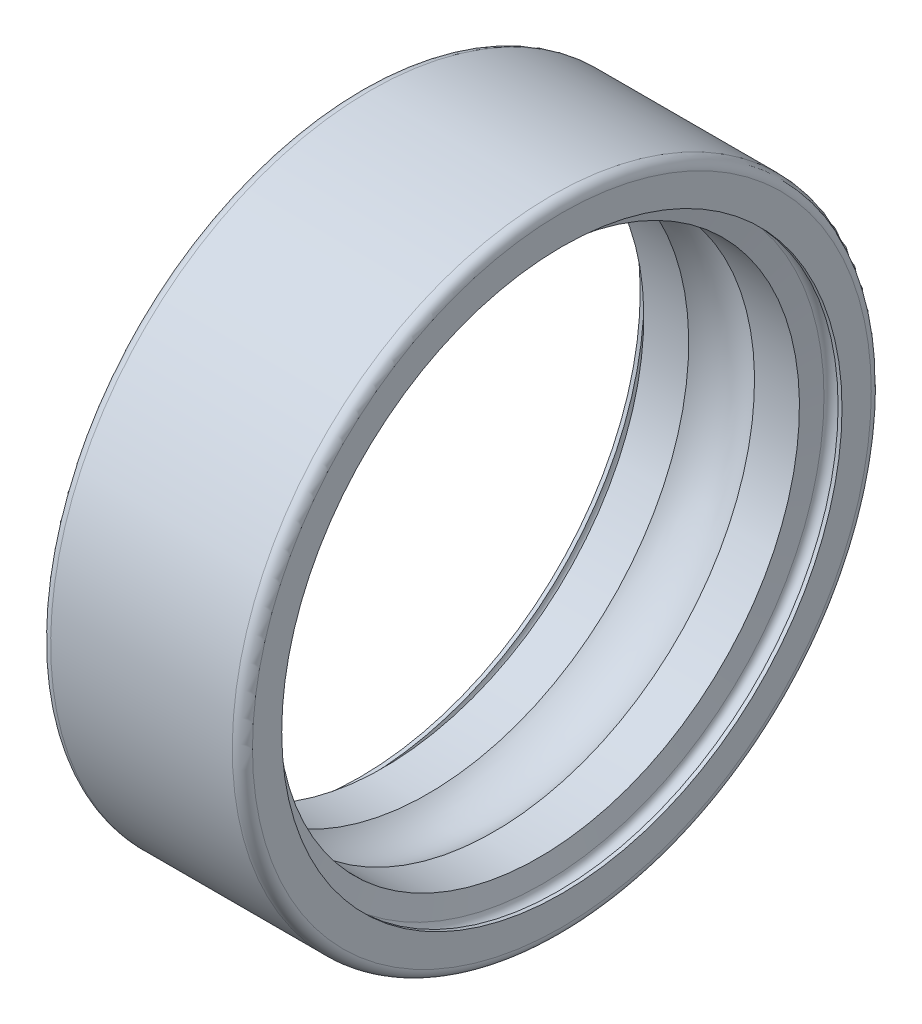
ISO-10303-21;
HEADER;
FILE_DESCRIPTION(('STEP AP214'),'2;1');
FILE_NAME('part.step','',(''),(''),'','','');
FILE_SCHEMA(('AUTOMOTIVE_DESIGN { 1 0 10303 214 1 1 1 1 }'));
ENDSEC;
DATA;
#1=APPLICATION_CONTEXT('core data for automotive mechanical design processes');
#2=APPLICATION_PROTOCOL_DEFINITION('international standard','automotive_design',2000,#1);
#3=PRODUCT_CONTEXT('',#1,'mechanical');
#4=PRODUCT('Part','Part','',(#3));
#5=PRODUCT_RELATED_PRODUCT_CATEGORY('part','',(#4));
#6=PRODUCT_DEFINITION_FORMATION('','',#4);
#7=PRODUCT_DEFINITION_CONTEXT('part definition',#1,'design');
#8=PRODUCT_DEFINITION('design','',#6,#7);
#9=PRODUCT_DEFINITION_SHAPE('','',#8);
#10=(LENGTH_UNIT() NAMED_UNIT(*) SI_UNIT(.MILLI.,.METRE.));
#11=(NAMED_UNIT(*) PLANE_ANGLE_UNIT() SI_UNIT($,.RADIAN.));
#12=(NAMED_UNIT(*) SI_UNIT($,.STERADIAN.) SOLID_ANGLE_UNIT());
#13=UNCERTAINTY_MEASURE_WITH_UNIT(LENGTH_MEASURE(1.E-05),#10,'distance_accuracy_value','');
#14=(GEOMETRIC_REPRESENTATION_CONTEXT(3) GLOBAL_UNCERTAINTY_ASSIGNED_CONTEXT((#13)) GLOBAL_UNIT_ASSIGNED_CONTEXT((#10,
#11,#12)) REPRESENTATION_CONTEXT('',''));
#15=CARTESIAN_POINT('',(0.,0.,0.));
#16=DIRECTION('',(0.,0.,1.));
#17=DIRECTION('',(1.,0.,0.));
#18=AXIS2_PLACEMENT_3D('',#15,#16,#17);
#19=CARTESIAN_POINT('',(5.652,0.,0.));
#20=DIRECTION('',(1.,0.,0.));
#21=DIRECTION('',(0.,0.,-1.));
#22=AXIS2_PLACEMENT_3D('',#19,#20,#21);
#23=TOROIDAL_SURFACE('',#22,8.33,0.232);
#24=CARTESIAN_POINT('',(5.884,0.,0.));
#25=DIRECTION('',(1.,0.,0.));
#26=DIRECTION('',(0.,1.,0.));
#27=AXIS2_PLACEMENT_3D('',#24,#25,#26);
#28=CIRCLE('',#27,8.33);
#29=CARTESIAN_POINT('',(5.884,8.33,0.));
#30=VERTEX_POINT('',#29);
#31=EDGE_CURVE('E10',#30,#30,#28,.T.);
#32=ORIENTED_EDGE('',*,*,#31,.T.);
#33=EDGE_LOOP('',(#32));
#34=FACE_BOUND('',#33,.T.);
#35=CARTESIAN_POINT('',(5.42352460130117,0.,0.));
#36=DIRECTION('',(1.,0.,0.));
#37=DIRECTION('',(0.,1.,0.));
#38=AXIS2_PLACEMENT_3D('',#35,#36,#37);
#39=CIRCLE('',#38,8.37028637721873);
#40=CARTESIAN_POINT('',(5.42352460130117,8.37028637721873,0.));
#41=VERTEX_POINT('',#40);
#42=EDGE_CURVE('E82',#41,#41,#39,.T.);
#43=ORIENTED_EDGE('',*,*,#42,.F.);
#44=EDGE_LOOP('',(#43));
#45=FACE_BOUND('',#44,.T.);
#46=ADVANCED_FACE('F15',(#34,#45),#23,.F.);
#47=CARTESIAN_POINT('',(5.942,0.,0.));
#48=DIRECTION('',(-1.,0.,0.));
#49=DIRECTION('',(0.,1.,0.));
#50=AXIS2_PLACEMENT_3D('',#47,#48,#49);
#51=CYLINDRICAL_SURFACE('',#50,8.33);
#52=CARTESIAN_POINT('',(6.,0.,0.));
#53=DIRECTION('',(1.,0.,0.));
#54=DIRECTION('',(0.,1.,0.));
#55=AXIS2_PLACEMENT_3D('',#52,#53,#54);
#56=CIRCLE('',#55,8.33);
#57=CARTESIAN_POINT('',(6.,8.33,0.));
#58=VERTEX_POINT('',#57);
#59=EDGE_CURVE('E25',#58,#58,#56,.T.);
#60=ORIENTED_EDGE('',*,*,#59,.T.);
#61=EDGE_LOOP('',(#60));
#62=FACE_BOUND('',#61,.T.);
#63=ORIENTED_EDGE('',*,*,#31,.F.);
#64=EDGE_LOOP('',(#63));
#65=FACE_BOUND('',#64,.T.);
#66=ADVANCED_FACE('F121',(#62,#65),#51,.F.);
#67=CARTESIAN_POINT('',(6.,8.765,0.));
#68=DIRECTION('',(1.,0.,0.));
#69=DIRECTION('',(0.,1.,0.));
#70=AXIS2_PLACEMENT_3D('',#67,#68,#69);
#71=PLANE('',#70);
#72=CARTESIAN_POINT('',(6.,0.,0.));
#73=DIRECTION('',(1.,0.,0.));
#74=DIRECTION('',(0.,1.,0.));
#75=AXIS2_PLACEMENT_3D('',#72,#73,#74);
#76=CIRCLE('',#75,9.2);
#77=CARTESIAN_POINT('',(6.,9.2,0.));
#78=VERTEX_POINT('',#77);
#79=EDGE_CURVE('E87',#78,#78,#76,.T.);
#80=ORIENTED_EDGE('',*,*,#79,.T.);
#81=EDGE_LOOP('',(#80));
#82=FACE_BOUND('',#81,.T.);
#83=ORIENTED_EDGE('',*,*,#59,.F.);
#84=EDGE_LOOP('',(#83));
#85=FACE_BOUND('',#84,.T.);
#86=ADVANCED_FACE('F125',(#82,#85),#71,.T.);
#87=CARTESIAN_POINT('',(5.7,0.,0.));
#88=DIRECTION('',(1.,0.,0.));
#89=DIRECTION('',(0.,0.,-1.));
#90=AXIS2_PLACEMENT_3D('',#87,#88,#89);
#91=TOROIDAL_SURFACE('',#90,9.2,0.3);
#92=CARTESIAN_POINT('',(5.7,0.,0.));
#93=DIRECTION('',(1.,0.,0.));
#94=DIRECTION('',(0.,1.,0.));
#95=AXIS2_PLACEMENT_3D('',#92,#93,#94);
#96=CIRCLE('',#95,9.5);
#97=CARTESIAN_POINT('',(5.7,9.5,0.));
#98=VERTEX_POINT('',#97);
#99=EDGE_CURVE('E85',#98,#98,#96,.T.);
#100=ORIENTED_EDGE('',*,*,#99,.T.);
#101=EDGE_LOOP('',(#100));
#102=FACE_BOUND('',#101,.T.);
#103=ORIENTED_EDGE('',*,*,#79,.F.);
#104=EDGE_LOOP('',(#103));
#105=FACE_BOUND('',#104,.T.);
#106=ADVANCED_FACE('F129',(#102,#105),#91,.T.);
#107=CARTESIAN_POINT('',(3.,0.,0.));
#108=DIRECTION('',(-1.,0.,0.));
#109=DIRECTION('',(0.,1.,0.));
#110=AXIS2_PLACEMENT_3D('',#107,#108,#109);
#111=CYLINDRICAL_SURFACE('',#110,9.5);
#112=CARTESIAN_POINT('',(0.3,0.,0.));
#113=DIRECTION('',(1.,0.,0.));
#114=DIRECTION('',(0.,1.,0.));
#115=AXIS2_PLACEMENT_3D('',#112,#113,#114);
#116=CIRCLE('',#115,9.5);
#117=CARTESIAN_POINT('',(0.3,9.5,0.));
#118=VERTEX_POINT('',#117);
#119=EDGE_CURVE('E83',#118,#118,#116,.T.);
#120=ORIENTED_EDGE('',*,*,#119,.T.);
#121=EDGE_LOOP('',(#120));
#122=FACE_BOUND('',#121,.T.);
#123=ORIENTED_EDGE('',*,*,#99,.F.);
#124=EDGE_LOOP('',(#123));
#125=FACE_BOUND('',#124,.T.);
#126=ADVANCED_FACE('F131',(#122,#125),#111,.T.);
#127=CARTESIAN_POINT('',(0.3,0.,0.));
#128=DIRECTION('',(1.,0.,0.));
#129=DIRECTION('',(0.,0.,-1.));
#130=AXIS2_PLACEMENT_3D('',#127,#128,#129);
#131=TOROIDAL_SURFACE('',#130,9.2,0.3);
#132=CARTESIAN_POINT('',(0.,0.,0.));
#133=DIRECTION('',(1.,0.,0.));
#134=DIRECTION('',(0.,1.,0.));
#135=AXIS2_PLACEMENT_3D('',#132,#133,#134);
#136=CIRCLE('',#135,9.2);
#137=CARTESIAN_POINT('',(0.,9.2,0.));
#138=VERTEX_POINT('',#137);
#139=EDGE_CURVE('E86',#138,#138,#136,.T.);
#140=ORIENTED_EDGE('',*,*,#139,.T.);
#141=EDGE_LOOP('',(#140));
#142=FACE_BOUND('',#141,.T.);
#143=ORIENTED_EDGE('',*,*,#119,.F.);
#144=EDGE_LOOP('',(#143));
#145=FACE_BOUND('',#144,.T.);
#146=ADVANCED_FACE('F156',(#142,#145),#131,.T.);
#147=CARTESIAN_POINT('',(0.,8.765,0.));
#148=DIRECTION('',(-1.,0.,0.));
#149=DIRECTION('',(0.,-1.,0.));
#150=AXIS2_PLACEMENT_3D('',#147,#148,#149);
#151=PLANE('',#150);
#152=CARTESIAN_POINT('',(0.,0.,0.));
#153=DIRECTION('',(1.,0.,0.));
#154=DIRECTION('',(0.,1.,0.));
#155=AXIS2_PLACEMENT_3D('',#152,#153,#154);
#156=CIRCLE('',#155,8.33);
#157=CARTESIAN_POINT('',(0.,8.33,0.));
#158=VERTEX_POINT('',#157);
#159=EDGE_CURVE('E88',#158,#158,#156,.T.);
#160=ORIENTED_EDGE('',*,*,#159,.T.);
#161=EDGE_LOOP('',(#160));
#162=FACE_BOUND('',#161,.T.);
#163=ORIENTED_EDGE('',*,*,#139,.F.);
#164=EDGE_LOOP('',(#163));
#165=FACE_BOUND('',#164,.T.);
#166=ADVANCED_FACE('F148',(#162,#165),#151,.T.);
#167=CARTESIAN_POINT('',(0.058,0.,0.));
#168=DIRECTION('',(-1.,0.,0.));
#169=DIRECTION('',(0.,1.,0.));
#170=AXIS2_PLACEMENT_3D('',#167,#168,#169);
#171=CYLINDRICAL_SURFACE('',#170,8.33);
#172=CARTESIAN_POINT('',(0.116,0.,0.));
#173=DIRECTION('',(1.,0.,0.));
#174=DIRECTION('',(0.,1.,0.));
#175=AXIS2_PLACEMENT_3D('',#172,#173,#174);
#176=CIRCLE('',#175,8.33);
#177=CARTESIAN_POINT('',(0.116,8.33,0.));
#178=VERTEX_POINT('',#177);
#179=EDGE_CURVE('E74',#178,#178,#176,.T.);
#180=ORIENTED_EDGE('',*,*,#179,.T.);
#181=EDGE_LOOP('',(#180));
#182=FACE_BOUND('',#181,.T.);
#183=ORIENTED_EDGE('',*,*,#159,.F.);
#184=EDGE_LOOP('',(#183));
#185=FACE_BOUND('',#184,.T.);
#186=ADVANCED_FACE('F143',(#182,#185),#171,.F.);
#187=CARTESIAN_POINT('',(0.348,0.,0.));
#188=DIRECTION('',(1.,0.,0.));
#189=DIRECTION('',(0.,0.,-1.));
#190=AXIS2_PLACEMENT_3D('',#187,#188,#189);
#191=TOROIDAL_SURFACE('',#190,8.33,0.232);
#192=CARTESIAN_POINT('',(0.576475398698832,0.,0.));
#193=DIRECTION('',(1.,0.,0.));
#194=DIRECTION('',(0.,1.,0.));
#195=AXIS2_PLACEMENT_3D('',#192,#193,#194);
#196=CIRCLE('',#195,8.37028637721873);
#197=CARTESIAN_POINT('',(0.576475398698832,8.37028637721873,0.));
#198=VERTEX_POINT('',#197);
#199=EDGE_CURVE('E65',#198,#198,#196,.T.);
#200=ORIENTED_EDGE('',*,*,#199,.T.);
#201=EDGE_LOOP('',(#200));
#202=FACE_BOUND('',#201,.T.);
#203=ORIENTED_EDGE('',*,*,#179,.F.);
#204=EDGE_LOOP('',(#203));
#205=FACE_BOUND('',#204,.T.);
#206=ADVANCED_FACE('F138',(#202,#205),#191,.F.);
#207=CARTESIAN_POINT('',(0.631162010733617,0.,0.));
#208=DIRECTION('',(-1.,0.,0.));
#209=DIRECTION('',(0.,1.,0.));
#210=AXIS2_PLACEMENT_3D('',#207,#208,#209);
#211=CONICAL_SURFACE('',#210,8.06014318860936,1.39626340159546);
#212=CARTESIAN_POINT('',(0.685848622768402,0.,0.));
#213=DIRECTION('',(1.,0.,0.));
#214=DIRECTION('',(0.,1.,0.));
#215=AXIS2_PLACEMENT_3D('',#212,#213,#214);
#216=CIRCLE('',#215,7.75);
#217=CARTESIAN_POINT('',(0.685848622768403,7.75,0.));
#218=VERTEX_POINT('',#217);
#219=EDGE_CURVE('E70',#218,#218,#216,.T.);
#220=ORIENTED_EDGE('',*,*,#219,.T.);
#221=EDGE_LOOP('',(#220));
#222=FACE_BOUND('',#221,.T.);
#223=ORIENTED_EDGE('',*,*,#199,.F.);
#224=EDGE_LOOP('',(#223));
#225=FACE_BOUND('',#224,.T.);
#226=ADVANCED_FACE('F17',(#222,#225),#211,.F.);
#227=CARTESIAN_POINT('',(1.35362474823296,0.,0.));
#228=DIRECTION('',(-1.,0.,0.));
#229=DIRECTION('',(0.,1.,0.));
#230=AXIS2_PLACEMENT_3D('',#227,#228,#229);
#231=CYLINDRICAL_SURFACE('',#230,7.75);
#232=CARTESIAN_POINT('',(2.02140087369751,0.,0.));
#233=DIRECTION('',(1.,0.,0.));
#234=DIRECTION('',(0.,1.,0.));
#235=AXIS2_PLACEMENT_3D('',#232,#233,#234);
#236=CIRCLE('',#235,7.75);
#237=CARTESIAN_POINT('',(2.02140087369751,7.75,0.));
#238=VERTEX_POINT('',#237);
#239=EDGE_CURVE('E19',#238,#238,#236,.T.);
#240=ORIENTED_EDGE('',*,*,#239,.T.);
#241=EDGE_LOOP('',(#240));
#242=FACE_BOUND('',#241,.T.);
#243=ORIENTED_EDGE('',*,*,#219,.F.);
#244=EDGE_LOOP('',(#243));
#245=FACE_BOUND('',#244,.T.);
#246=ADVANCED_FACE('F116',(#242,#245),#231,.F.);
#247=CARTESIAN_POINT('',(3.,0.,0.));
#248=DIRECTION('',(1.,0.,0.));
#249=DIRECTION('',(0.,0.,-1.));
#250=AXIS2_PLACEMENT_3D('',#247,#248,#249);
#251=TOROIDAL_SURFACE('',#250,6.5,1.5875);
#252=CARTESIAN_POINT('',(3.97859912630249,0.,0.));
#253=DIRECTION('',(1.,0.,0.));
#254=DIRECTION('',(0.,1.,0.));
#255=AXIS2_PLACEMENT_3D('',#252,#253,#254);
#256=CIRCLE('',#255,7.75);
#257=CARTESIAN_POINT('',(3.97859912630249,7.75,0.));
#258=VERTEX_POINT('',#257);
#259=EDGE_CURVE('E76',#258,#258,#256,.T.);
#260=ORIENTED_EDGE('',*,*,#259,.T.);
#261=EDGE_LOOP('',(#260));
#262=FACE_BOUND('',#261,.T.);
#263=ORIENTED_EDGE('',*,*,#239,.F.);
#264=EDGE_LOOP('',(#263));
#265=FACE_BOUND('',#264,.T.);
#266=ADVANCED_FACE('F102',(#262,#265),#251,.F.);
#267=CARTESIAN_POINT('',(4.64637525176704,0.,0.));
#268=DIRECTION('',(-1.,0.,0.));
#269=DIRECTION('',(0.,1.,0.));
#270=AXIS2_PLACEMENT_3D('',#267,#268,#269);
#271=CYLINDRICAL_SURFACE('',#270,7.75);
#272=CARTESIAN_POINT('',(5.3141513772316,0.,0.));
#273=DIRECTION('',(1.,0.,0.));
#274=DIRECTION('',(0.,1.,0.));
#275=AXIS2_PLACEMENT_3D('',#272,#273,#274);
#276=CIRCLE('',#275,7.75);
#277=CARTESIAN_POINT('',(5.3141513772316,7.75,0.));
#278=VERTEX_POINT('',#277);
#279=EDGE_CURVE('E80',#278,#278,#276,.T.);
#280=ORIENTED_EDGE('',*,*,#279,.T.);
#281=EDGE_LOOP('',(#280));
#282=FACE_BOUND('',#281,.T.);
#283=ORIENTED_EDGE('',*,*,#259,.F.);
#284=EDGE_LOOP('',(#283));
#285=FACE_BOUND('',#284,.T.);
#286=ADVANCED_FACE('F105',(#282,#285),#271,.F.);
#287=CARTESIAN_POINT('',(5.36883798926638,0.,0.));
#288=DIRECTION('',(1.,0.,0.));
#289=DIRECTION('',(0.,1.,0.));
#290=AXIS2_PLACEMENT_3D('',#287,#288,#289);
#291=CONICAL_SURFACE('',#290,8.06014318860936,1.39626340159546);
#292=ORIENTED_EDGE('',*,*,#42,.T.);
#293=EDGE_LOOP('',(#292));
#294=FACE_BOUND('',#293,.T.);
#295=ORIENTED_EDGE('',*,*,#279,.F.);
#296=EDGE_LOOP('',(#295));
#297=FACE_BOUND('',#296,.T.);
#298=ADVANCED_FACE('F107',(#294,#297),#291,.F.);
#299=CLOSED_SHELL('',(#46,#66,#86,#106,#126,#146,#166,#186,#206,#226,#246,#266,#286,#298));
#300=MANIFOLD_SOLID_BREP('B1',#299);
#301=ADVANCED_BREP_SHAPE_REPRESENTATION('',(#18,#300),#14);
#302=SHAPE_DEFINITION_REPRESENTATION(#9,#301);
ENDSEC;
END-ISO-10303-21;
